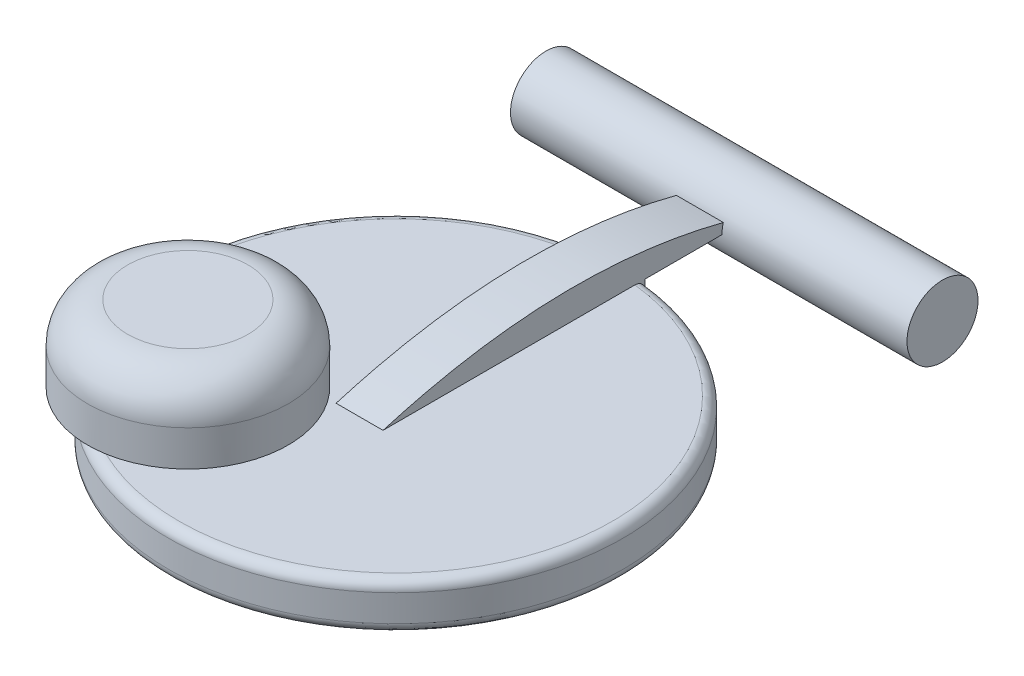
ISO-10303-21;
HEADER;
FILE_DESCRIPTION(('STEP AP214'),'2;1');
FILE_NAME('part.step','',(''),(''),'','','');
FILE_SCHEMA(('AUTOMOTIVE_DESIGN { 1 0 10303 214 1 1 1 1 }'));
ENDSEC;
DATA;
#1=APPLICATION_CONTEXT('core data for automotive mechanical design processes');
#2=APPLICATION_PROTOCOL_DEFINITION('international standard','automotive_design',2000,#1);
#3=PRODUCT_CONTEXT('',#1,'mechanical');
#4=PRODUCT('Part','Part','',(#3));
#5=PRODUCT_RELATED_PRODUCT_CATEGORY('part','',(#4));
#6=PRODUCT_DEFINITION_FORMATION('','',#4);
#7=PRODUCT_DEFINITION_CONTEXT('part definition',#1,'design');
#8=PRODUCT_DEFINITION('design','',#6,#7);
#9=PRODUCT_DEFINITION_SHAPE('','',#8);
#10=(LENGTH_UNIT() NAMED_UNIT(*) SI_UNIT(.MILLI.,.METRE.));
#11=(NAMED_UNIT(*) PLANE_ANGLE_UNIT() SI_UNIT($,.RADIAN.));
#12=(NAMED_UNIT(*) SI_UNIT($,.STERADIAN.) SOLID_ANGLE_UNIT());
#13=UNCERTAINTY_MEASURE_WITH_UNIT(LENGTH_MEASURE(1.E-05),#10,'distance_accuracy_value','');
#14=(GEOMETRIC_REPRESENTATION_CONTEXT(3) GLOBAL_UNCERTAINTY_ASSIGNED_CONTEXT((#13)) GLOBAL_UNIT_ASSIGNED_CONTEXT((#10,
#11,#12)) REPRESENTATION_CONTEXT('',''));
#15=CARTESIAN_POINT('',(0.,0.,0.));
#16=DIRECTION('',(0.,0.,1.));
#17=DIRECTION('',(1.,0.,0.));
#18=AXIS2_PLACEMENT_3D('',#15,#16,#17);
#19=CARTESIAN_POINT('',(25.0952,0.,0.));
#20=DIRECTION('',(-1.,0.,0.));
#21=DIRECTION('',(0.,0.,1.));
#22=AXIS2_PLACEMENT_3D('',#19,#20,#21);
#23=CYLINDRICAL_SURFACE('',#22,2.2479);
#24=CARTESIAN_POINT('',(0.,0.,0.));
#25=DIRECTION('',(1.,0.,0.));
#26=DIRECTION('',(0.,0.,-1.));
#27=AXIS2_PLACEMENT_3D('',#24,#25,#26);
#28=CIRCLE('',#27,2.2479);
#29=CARTESIAN_POINT('',(0.,0.,-2.2479));
#30=VERTEX_POINT('',#29);
#31=EDGE_CURVE('E253',#30,#30,#28,.T.);
#32=ORIENTED_EDGE('',*,*,#31,.T.);
#33=EDGE_LOOP('',(#32));
#34=FACE_BOUND('',#33,.T.);
#35=CARTESIAN_POINT('',(25.0952,0.,0.));
#36=DIRECTION('',(1.,0.,0.));
#37=DIRECTION('',(0.,0.,-1.));
#38=AXIS2_PLACEMENT_3D('',#35,#36,#37);
#39=CIRCLE('',#38,2.2479);
#40=CARTESIAN_POINT('',(25.0952,0.,-2.2479));
#41=VERTEX_POINT('',#40);
#42=EDGE_CURVE('E209',#41,#41,#39,.T.);
#43=ORIENTED_EDGE('',*,*,#42,.F.);
#44=EDGE_LOOP('',(#43));
#45=FACE_BOUND('',#44,.T.);
#46=CARTESIAN_POINT('',(13.3858,0.,0.));
#47=DIRECTION('',(-1.,0.,0.));
#48=DIRECTION('',(0.,0.,1.));
#49=AXIS2_PLACEMENT_3D('',#46,#47,#48);
#50=CIRCLE('',#49,2.2479);
#51=CARTESIAN_POINT('',(13.3858,0.,2.2479));
#52=VERTEX_POINT('',#51);
#53=CARTESIAN_POINT('',(13.3858,0.624937720984176,2.1592839680994));
#54=VERTEX_POINT('',#53);
#55=EDGE_CURVE('E213',#52,#54,#50,.T.);
#56=ORIENTED_EDGE('',*,*,#55,.F.);
#57=DIRECTION('',(-1.,0.,0.));
#58=VECTOR('',#57,1.);
#59=CARTESIAN_POINT('',(25.0952,0.,2.2479));
#60=LINE('',#59,#58);
#61=CARTESIAN_POINT('',(10.414,0.,2.2479));
#62=VERTEX_POINT('',#61);
#63=EDGE_CURVE('E208',#62,#52,#60,.F.);
#64=ORIENTED_EDGE('',*,*,#63,.F.);
#65=CARTESIAN_POINT('',(10.414,0.,0.));
#66=DIRECTION('',(-1.,0.,0.));
#67=DIRECTION('',(0.,0.,1.));
#68=AXIS2_PLACEMENT_3D('',#65,#66,#67);
#69=CIRCLE('',#68,2.2479);
#70=CARTESIAN_POINT('',(10.414,0.624937720984176,2.1592839680994));
#71=VERTEX_POINT('',#70);
#72=EDGE_CURVE('E198',#62,#71,#69,.T.);
#73=ORIENTED_EDGE('',*,*,#72,.T.);
#74=DIRECTION('',(-1.,0.,0.));
#75=VECTOR('',#74,1.);
#76=CARTESIAN_POINT('',(13.3858,0.624937720984176,2.1592839680994));
#77=LINE('',#76,#75);
#78=EDGE_CURVE('E217',#54,#71,#77,.T.);
#79=ORIENTED_EDGE('',*,*,#78,.F.);
#80=EDGE_LOOP('',(#56,#64,#73,#79));
#81=FACE_BOUND('',#80,.T.);
#82=ADVANCED_FACE('F39',(#34,#45,#81),#23,.T.);
#83=CARTESIAN_POINT('',(25.0952,0.,0.));
#84=DIRECTION('',(1.,0.,0.));
#85=DIRECTION('',(0.,0.,-1.));
#86=AXIS2_PLACEMENT_3D('',#83,#84,#85);
#87=PLANE('',#86);
#88=ORIENTED_EDGE('',*,*,#42,.T.);
#89=EDGE_LOOP('',(#88));
#90=FACE_BOUND('',#89,.T.);
#91=ADVANCED_FACE('F152',(#90),#87,.T.);
#92=CARTESIAN_POINT('',(0.,0.,0.));
#93=DIRECTION('',(1.,0.,0.));
#94=DIRECTION('',(0.,0.,-1.));
#95=AXIS2_PLACEMENT_3D('',#92,#93,#94);
#96=PLANE('',#95);
#97=ORIENTED_EDGE('',*,*,#31,.F.);
#98=EDGE_LOOP('',(#97));
#99=FACE_BOUND('',#98,.T.);
#100=ADVANCED_FACE('F149',(#99),#96,.F.);
#101=CARTESIAN_POINT('',(13.3858,0.,0.));
#102=CARTESIAN_POINT('',(13.3858,3.66065338683689,11.4154433747726));
#103=CARTESIAN_POINT('',(13.3858,0.,23.6982));
#104=B_SPLINE_CURVE_WITH_KNOTS('',2,(#101,#102,#103),.UNSPECIFIED.,.F.,.F.,(3,3),(0.,1.),.UNSPECIFIED.);
#105=DIRECTION('',(-1.,0.,0.));
#106=VECTOR('',#105,1.);
#107=SURFACE_OF_LINEAR_EXTRUSION('',#104,#106);
#108=CARTESIAN_POINT('',(13.3858,0.,23.6982));
#109=VERTEX_POINT('',#108);
#110=EDGE_CURVE('E130',#54,#109,#104,.T.);
#111=ORIENTED_EDGE('',*,*,#110,.F.);
#112=ORIENTED_EDGE('',*,*,#78,.T.);
#113=CARTESIAN_POINT('',(10.414,0.,0.));
#114=CARTESIAN_POINT('',(10.414,3.66065338683689,11.4154433747726));
#115=CARTESIAN_POINT('',(10.414,0.,23.6982));
#116=B_SPLINE_CURVE_WITH_KNOTS('',2,(#113,#114,#115),.UNSPECIFIED.,.F.,.F.,(3,3),(0.,1.),.UNSPECIFIED.);
#117=CARTESIAN_POINT('',(10.414,0.,23.6982));
#118=VERTEX_POINT('',#117);
#119=EDGE_CURVE('E129',#71,#118,#116,.T.);
#120=ORIENTED_EDGE('',*,*,#119,.T.);
#121=DIRECTION('',(-1.,0.,0.));
#122=VECTOR('',#121,1.);
#123=CARTESIAN_POINT('',(13.3858,0.,23.6982));
#124=LINE('',#123,#122);
#125=EDGE_CURVE('E244',#109,#118,#124,.T.);
#126=ORIENTED_EDGE('',*,*,#125,.F.);
#127=EDGE_LOOP('',(#111,#112,#120,#126));
#128=FACE_BOUND('',#127,.T.);
#129=ADVANCED_FACE('F144',(#128),#107,.F.);
#130=CARTESIAN_POINT('',(13.3858,0.,0.));
#131=DIRECTION('',(0.,1.,0.));
#132=DIRECTION('',(0.,0.,1.));
#133=AXIS2_PLACEMENT_3D('',#130,#131,#132);
#134=PLANE('',#133);
#135=CARTESIAN_POINT('',(11.8999,0.,21.4057297610828));
#136=DIRECTION('',(0.,-1.,0.));
#137=DIRECTION('',(0.,0.,-1.));
#138=AXIS2_PLACEMENT_3D('',#135,#136,#137);
#139=CIRCLE('',#138,14.3637);
#140=CARTESIAN_POINT('',(10.414,0.,7.11909338718434));
#141=VERTEX_POINT('',#140);
#142=CARTESIAN_POINT('',(13.3858,0.,7.11909338718434));
#143=VERTEX_POINT('',#142);
#144=EDGE_CURVE('E118',#141,#143,#139,.T.);
#145=ORIENTED_EDGE('',*,*,#144,.F.);
#146=DIRECTION('',(0.,0.,-1.));
#147=VECTOR('',#146,1.);
#148=CARTESIAN_POINT('',(10.414,0.,0.));
#149=LINE('',#148,#147);
#150=EDGE_CURVE('E201',#141,#62,#149,.T.);
#151=ORIENTED_EDGE('',*,*,#150,.T.);
#152=ORIENTED_EDGE('',*,*,#63,.T.);
#153=DIRECTION('',(0.,0.,-1.));
#154=VECTOR('',#153,1.);
#155=CARTESIAN_POINT('',(13.3858,0.,0.));
#156=LINE('',#155,#154);
#157=EDGE_CURVE('E136',#143,#52,#156,.T.);
#158=ORIENTED_EDGE('',*,*,#157,.F.);
#159=EDGE_LOOP('',(#145,#151,#152,#158));
#160=FACE_BOUND('',#159,.T.);
#161=ADVANCED_FACE('F148',(#160),#134,.F.);
#162=CARTESIAN_POINT('',(13.3858,1.83032669341844,11.6322716873863));
#163=DIRECTION('',(-1.,0.,0.));
#164=DIRECTION('',(0.,0.,1.));
#165=AXIS2_PLACEMENT_3D('',#162,#163,#164);
#166=PLANE('',#165);
#167=CARTESIAN_POINT('',(13.3858,0.,7.75767843937395));
#168=VERTEX_POINT('',#167);
#169=EDGE_CURVE('E138',#109,#168,#156,.T.);
#170=ORIENTED_EDGE('',*,*,#169,.T.);
#171=CARTESIAN_POINT('',(13.3858,0.,7.75767843937395));
#172=CARTESIAN_POINT('',(13.3858,2.97068111461027E-05,7.72160117518703));
#173=CARTESIAN_POINT('',(13.3858,-0.00303682064163267,7.68553150399673));
#174=CARTESIAN_POINT('',(13.3858,-0.0151466425570312,7.61443119839856));
#175=CARTESIAN_POINT('',(13.3858,-0.0241863126812481,7.57939994736554));
#176=CARTESIAN_POINT('',(13.3858,-0.0480337394976081,7.51133549365649));
#177=CARTESIAN_POINT('',(13.3858,-0.0628446585327272,7.47830339789734));
#178=CARTESIAN_POINT('',(13.3858,-0.0978123026150151,7.41521097893355));
#179=CARTESIAN_POINT('',(13.3858,-0.117967805928113,7.38514997871063));
#180=CARTESIAN_POINT('',(13.3858,-0.163000829874994,7.32894173259384));
#181=CARTESIAN_POINT('',(13.3858,-0.187864772187398,7.30278361005332));
#182=CARTESIAN_POINT('',(13.3858,-0.241658567642368,7.25503488159229));
#183=CARTESIAN_POINT('',(13.3858,-0.270589175021046,7.23344512482247));
#184=CARTESIAN_POINT('',(13.3858,-0.33152627761765,7.19557314427944));
#185=CARTESIAN_POINT('',(13.3858,-0.363516107796267,7.17926407357612));
#186=CARTESIAN_POINT('',(13.3858,-0.429781699348276,7.15228675449933));
#187=CARTESIAN_POINT('',(13.3858,-0.464055926974395,7.14161476350328));
#188=CARTESIAN_POINT('',(13.3858,-0.521298764311682,7.12898958243914));
#189=CARTESIAN_POINT('',(13.3858,-0.543895398009902,7.12528070953769));
#190=CARTESIAN_POINT('',(13.3858,-0.589324733486296,7.12033304911269));
#191=CARTESIAN_POINT('',(13.3858,-0.612157051893343,7.11909074033862));
#192=CARTESIAN_POINT('',(13.3858,-0.635,7.11909338718434));
#193=B_SPLINE_CURVE_WITH_KNOTS('',3,(#171,#172,#173,#174,#175,#176,#177,#178,#179,#180,#181,
#182,#183,#184,#185,#186,#187,#188,#189,#190,#191,#192),.UNSPECIFIED.,.F.,.F.,(4,2,2,2,2,2,2,2,
2,2,4),(0.,0.108091061507948,0.216116596490901,0.32420140725107,0.432261531857593,
0.540014648949092,0.647787777225935,0.755004056416397,0.86214906181509,0.930721396033382,
0.999195766253674),.UNSPECIFIED.);
#194=CARTESIAN_POINT('',(13.3858,-0.635,7.11909338718434));
#195=VERTEX_POINT('',#194);
#196=EDGE_CURVE('E102',#168,#195,#193,.T.);
#197=ORIENTED_EDGE('',*,*,#196,.T.);
#198=DIRECTION('',(0.,1.,0.));
#199=VECTOR('',#198,1.);
#200=CARTESIAN_POINT('',(13.3858,0.,7.11909338718434));
#201=LINE('',#200,#199);
#202=EDGE_CURVE('E63',#143,#195,#201,.F.);
#203=ORIENTED_EDGE('',*,*,#202,.F.);
#204=ORIENTED_EDGE('',*,*,#157,.T.);
#205=ORIENTED_EDGE('',*,*,#55,.T.);
#206=ORIENTED_EDGE('',*,*,#110,.T.);
#207=EDGE_LOOP('',(#170,#197,#203,#204,#205,#206));
#208=FACE_BOUND('',#207,.T.);
#209=ADVANCED_FACE('F182',(#208),#166,.F.);
#210=CARTESIAN_POINT('',(10.414,1.83032669341844,11.6322716873863));
#211=DIRECTION('',(-1.,0.,0.));
#212=DIRECTION('',(0.,0.,1.));
#213=AXIS2_PLACEMENT_3D('',#210,#211,#212);
#214=PLANE('',#213);
#215=ORIENTED_EDGE('',*,*,#72,.F.);
#216=ORIENTED_EDGE('',*,*,#150,.F.);
#217=DIRECTION('',(0.,1.,0.));
#218=VECTOR('',#217,1.);
#219=CARTESIAN_POINT('',(10.414,-0.635,7.11909338718434));
#220=LINE('',#219,#218);
#221=CARTESIAN_POINT('',(10.414,-0.635,7.11909338718434));
#222=VERTEX_POINT('',#221);
#223=EDGE_CURVE('E235',#222,#141,#220,.T.);
#224=ORIENTED_EDGE('',*,*,#223,.F.);
#225=CARTESIAN_POINT('',(10.414,-0.635,7.11909338718434));
#226=CARTESIAN_POINT('',(10.414,-0.59941665060096,7.11906227621359));
#227=CARTESIAN_POINT('',(10.414,-0.563843459084194,7.12209858933455));
#228=CARTESIAN_POINT('',(10.414,-0.493737871331731,7.13407519672551));
#229=CARTESIAN_POINT('',(10.414,-0.45920453449133,7.14300997685231));
#230=CARTESIAN_POINT('',(10.414,-0.392114595997997,7.16655849997247));
#231=CARTESIAN_POINT('',(10.414,-0.359558850596535,7.18117468290072));
#232=CARTESIAN_POINT('',(10.414,-0.297359781720227,7.2156488574687));
#233=CARTESIAN_POINT('',(10.414,-0.267716066469407,7.23550614265701));
#234=CARTESIAN_POINT('',(10.414,-0.212099585063527,7.27994490823891));
#235=CARTESIAN_POINT('',(10.414,-0.186135392780347,7.30453711744254));
#236=CARTESIAN_POINT('',(10.414,-0.138673770741469,7.35771696560872));
#237=CARTESIAN_POINT('',(10.414,-0.117177251250485,7.38630541680379));
#238=CARTESIAN_POINT('',(10.414,-0.0791462945986569,7.4468199595304));
#239=CARTESIAN_POINT('',(10.414,-0.0626387155338492,7.4787629113213));
#240=CARTESIAN_POINT('',(10.414,-0.0351967422836382,7.54495153606811));
#241=CARTESIAN_POINT('',(10.414,-0.0242595528976203,7.57919604432682));
#242=CARTESIAN_POINT('',(10.414,-0.01085189480763,7.63763752393045));
#243=CARTESIAN_POINT('',(10.414,-0.00678474874526031,7.66148076187855));
#244=CARTESIAN_POINT('',(10.414,-0.00135906570800855,7.70943899778735));
#245=CARTESIAN_POINT('',(10.414,3.3198450494382E-06,7.73355356044249));
#246=CARTESIAN_POINT('',(10.414,0.,7.75767843937395));
#247=B_SPLINE_CURVE_WITH_KNOTS('',3,(#225,#226,#227,#228,#229,#230,#231,#232,#233,#234,#235,
#236,#237,#238,#239,#240,#241,#242,#243,#244,#245,#246),.UNSPECIFIED.,.F.,.F.,(4,2,2,2,2,2,2,2,
2,2,4),(0.,0.10660597348858,0.213112427939985,0.319664673272789,0.426202563690399,
0.532984760139044,0.639788691613397,0.747157762414153,0.854472902604054,0.92689211717815,
0.999208213071355),.UNSPECIFIED.);
#248=CARTESIAN_POINT('',(10.414,0.,7.75767843937395));
#249=VERTEX_POINT('',#248);
#250=EDGE_CURVE('E170',#222,#249,#247,.T.);
#251=ORIENTED_EDGE('',*,*,#250,.T.);
#252=EDGE_CURVE('E137',#118,#249,#149,.T.);
#253=ORIENTED_EDGE('',*,*,#252,.F.);
#254=ORIENTED_EDGE('',*,*,#119,.F.);
#255=EDGE_LOOP('',(#215,#216,#224,#251,#253,#254));
#256=FACE_BOUND('',#255,.T.);
#257=ADVANCED_FACE('F186',(#256),#214,.T.);
#258=CARTESIAN_POINT('',(11.8999,0.,21.4057297610828));
#259=DIRECTION('',(0.,-1.,0.));
#260=DIRECTION('',(0.,0.,-1.));
#261=AXIS2_PLACEMENT_3D('',#258,#259,#260);
#262=PLANE('',#261);
#263=CARTESIAN_POINT('',(4.84420956713798,0.,27.5082));
#264=DIRECTION('',(0.,1.,0.));
#265=DIRECTION('',(0.,0.,1.));
#266=AXIS2_PLACEMENT_3D('',#263,#264,#265);
#267=CIRCLE('',#266,6.35);
#268=CARTESIAN_POINT('',(5.92421754449995,0.,33.7656821429098));
#269=VERTEX_POINT('',#268);
#270=CARTESIAN_POINT('',(-1.19227488131793,0.,25.5375768742984));
#271=VERTEX_POINT('',#270);
#272=EDGE_CURVE('E111',#269,#271,#267,.T.);
#273=ORIENTED_EDGE('',*,*,#272,.F.);
#274=CARTESIAN_POINT('',(11.8999,0.,21.4057297610828));
#275=DIRECTION('',(0.,-1.,0.));
#276=DIRECTION('',(0.,0.,-1.));
#277=AXIS2_PLACEMENT_3D('',#274,#275,#276);
#278=CIRCLE('',#277,13.7287);
#279=EDGE_CURVE('E98',#269,#168,#278,.F.);
#280=ORIENTED_EDGE('',*,*,#279,.T.);
#281=ORIENTED_EDGE('',*,*,#169,.F.);
#282=ORIENTED_EDGE('',*,*,#125,.T.);
#283=ORIENTED_EDGE('',*,*,#252,.T.);
#284=EDGE_CURVE('E109',#249,#271,#278,.F.);
#285=ORIENTED_EDGE('',*,*,#284,.T.);
#286=EDGE_LOOP('',(#273,#280,#281,#282,#283,#285));
#287=FACE_BOUND('',#286,.T.);
#288=ADVANCED_FACE('F112',(#287),#262,.F.);
#289=CARTESIAN_POINT('',(11.8999,-2.9718,21.4057297610828));
#290=DIRECTION('',(0.,1.,0.));
#291=DIRECTION('',(0.,0.,1.));
#292=AXIS2_PLACEMENT_3D('',#289,#290,#291);
#293=CYLINDRICAL_SURFACE('',#292,14.3637);
#294=CARTESIAN_POINT('',(11.8999,-2.3368,21.4057297610828));
#295=DIRECTION('',(0.,-1.,0.));
#296=DIRECTION('',(0.,0.,-1.));
#297=AXIS2_PLACEMENT_3D('',#294,#295,#296);
#298=CIRCLE('',#297,14.3637);
#299=CARTESIAN_POINT('',(11.8999,-2.3368,7.04202976108285));
#300=VERTEX_POINT('',#299);
#301=EDGE_CURVE('E107',#300,#300,#298,.F.);
#302=ORIENTED_EDGE('',*,*,#301,.T.);
#303=EDGE_LOOP('',(#302));
#304=FACE_BOUND('',#303,.T.);
#305=CARTESIAN_POINT('',(11.8999,-0.635,21.4057297610828));
#306=DIRECTION('',(0.,-1.,0.));
#307=DIRECTION('',(0.,0.,-1.));
#308=AXIS2_PLACEMENT_3D('',#305,#306,#307);
#309=CIRCLE('',#308,14.3637);
#310=EDGE_CURVE('E231',#195,#222,#309,.T.);
#311=ORIENTED_EDGE('',*,*,#310,.T.);
#312=ORIENTED_EDGE('',*,*,#223,.T.);
#313=ORIENTED_EDGE('',*,*,#144,.T.);
#314=ORIENTED_EDGE('',*,*,#202,.T.);
#315=EDGE_LOOP('',(#311,#312,#313,#314));
#316=FACE_BOUND('',#315,.T.);
#317=ADVANCED_FACE('F187',(#304,#316),#293,.T.);
#318=CARTESIAN_POINT('',(11.8999,-2.9718,21.4057297610828));
#319=DIRECTION('',(0.,-1.,0.));
#320=DIRECTION('',(0.,0.,-1.));
#321=AXIS2_PLACEMENT_3D('',#318,#319,#320);
#322=PLANE('',#321);
#323=CARTESIAN_POINT('',(11.8999,-2.9718,21.4057297610828));
#324=DIRECTION('',(0.,-1.,0.));
#325=DIRECTION('',(0.,0.,-1.));
#326=AXIS2_PLACEMENT_3D('',#323,#324,#325);
#327=CIRCLE('',#326,13.7287);
#328=CARTESIAN_POINT('',(11.8999,-2.9718,7.67702976108285));
#329=VERTEX_POINT('',#328);
#330=EDGE_CURVE('E225',#329,#329,#327,.T.);
#331=ORIENTED_EDGE('',*,*,#330,.T.);
#332=EDGE_LOOP('',(#331));
#333=FACE_BOUND('',#332,.T.);
#334=ADVANCED_FACE('F164',(#333),#322,.T.);
#335=CARTESIAN_POINT('',(11.8999,-2.3368,21.4057297610828));
#336=DIRECTION('',(0.,-1.,0.));
#337=DIRECTION('',(0.,0.,-1.));
#338=AXIS2_PLACEMENT_3D('',#335,#336,#337);
#339=TOROIDAL_SURFACE('',#338,13.7287,0.635);
#340=ORIENTED_EDGE('',*,*,#301,.F.);
#341=EDGE_LOOP('',(#340));
#342=FACE_BOUND('',#341,.T.);
#343=ORIENTED_EDGE('',*,*,#330,.F.);
#344=EDGE_LOOP('',(#343));
#345=FACE_BOUND('',#344,.T.);
#346=ADVANCED_FACE('F162',(#342,#345),#339,.T.);
#347=CARTESIAN_POINT('',(11.8999,-0.635,21.4057297610828));
#348=DIRECTION('',(0.,-1.,0.));
#349=DIRECTION('',(0.,0.,-1.));
#350=AXIS2_PLACEMENT_3D('',#347,#348,#349);
#351=TOROIDAL_SURFACE('',#350,13.7287,0.635);
#352=ORIENTED_EDGE('',*,*,#196,.F.);
#353=ORIENTED_EDGE('',*,*,#279,.F.);
#354=EDGE_CURVE('E55',#271,#269,#278,.F.);
#355=ORIENTED_EDGE('',*,*,#354,.F.);
#356=ORIENTED_EDGE('',*,*,#284,.F.);
#357=ORIENTED_EDGE('',*,*,#250,.F.);
#358=ORIENTED_EDGE('',*,*,#310,.F.);
#359=EDGE_LOOP('',(#352,#353,#355,#356,#357,#358));
#360=FACE_BOUND('',#359,.T.);
#361=ADVANCED_FACE('F100',(#360),#351,.T.);
#362=CARTESIAN_POINT('',(4.84420956713798,4.8006,27.5082));
#363=DIRECTION('',(0.,-1.,0.));
#364=DIRECTION('',(0.,0.,-1.));
#365=AXIS2_PLACEMENT_3D('',#362,#363,#364);
#366=CYLINDRICAL_SURFACE('',#365,6.35);
#367=CARTESIAN_POINT('',(4.84420956713798,2.2606,27.5082));
#368=DIRECTION('',(0.,1.,0.));
#369=DIRECTION('',(0.,0.,1.));
#370=AXIS2_PLACEMENT_3D('',#367,#368,#369);
#371=CIRCLE('',#370,6.35);
#372=CARTESIAN_POINT('',(4.84420956713798,2.2606,33.8582));
#373=VERTEX_POINT('',#372);
#374=EDGE_CURVE('E11',#373,#373,#371,.F.);
#375=ORIENTED_EDGE('',*,*,#374,.T.);
#376=EDGE_LOOP('',(#375));
#377=FACE_BOUND('',#376,.T.);
#378=ORIENTED_EDGE('',*,*,#272,.T.);
#379=EDGE_CURVE('E119',#271,#269,#267,.T.);
#380=ORIENTED_EDGE('',*,*,#379,.T.);
#381=EDGE_LOOP('',(#378,#380));
#382=FACE_BOUND('',#381,.T.);
#383=ADVANCED_FACE('F124',(#377,#382),#366,.T.);
#384=CARTESIAN_POINT('',(4.84420956713798,4.8006,27.5082));
#385=DIRECTION('',(0.,1.,0.));
#386=DIRECTION('',(0.,0.,1.));
#387=AXIS2_PLACEMENT_3D('',#384,#385,#386);
#388=PLANE('',#387);
#389=CARTESIAN_POINT('',(4.84420956713798,4.8006,27.5082));
#390=DIRECTION('',(0.,1.,0.));
#391=DIRECTION('',(0.,0.,1.));
#392=AXIS2_PLACEMENT_3D('',#389,#390,#391);
#393=CIRCLE('',#392,3.81);
#394=CARTESIAN_POINT('',(4.84420956713798,4.8006,31.3182));
#395=VERTEX_POINT('',#394);
#396=EDGE_CURVE('E48',#395,#395,#393,.T.);
#397=ORIENTED_EDGE('',*,*,#396,.T.);
#398=EDGE_LOOP('',(#397));
#399=FACE_BOUND('',#398,.T.);
#400=ADVANCED_FACE('F280',(#399),#388,.T.);
#401=CARTESIAN_POINT('',(4.84420956713798,0.,27.5082));
#402=DIRECTION('',(0.,1.,0.));
#403=DIRECTION('',(0.,0.,1.));
#404=AXIS2_PLACEMENT_3D('',#401,#402,#403);
#405=PLANE('',#404);
#406=ORIENTED_EDGE('',*,*,#379,.F.);
#407=ORIENTED_EDGE('',*,*,#354,.T.);
#408=EDGE_LOOP('',(#406,#407));
#409=FACE_BOUND('',#408,.T.);
#410=ADVANCED_FACE('F122',(#409),#405,.F.);
#411=CARTESIAN_POINT('',(4.84420956713798,2.2606,27.5082));
#412=DIRECTION('',(0.,1.,0.));
#413=DIRECTION('',(0.,0.,1.));
#414=AXIS2_PLACEMENT_3D('',#411,#412,#413);
#415=TOROIDAL_SURFACE('',#414,3.81,2.54);
#416=ORIENTED_EDGE('',*,*,#374,.F.);
#417=EDGE_LOOP('',(#416));
#418=FACE_BOUND('',#417,.T.);
#419=ORIENTED_EDGE('',*,*,#396,.F.);
#420=EDGE_LOOP('',(#419));
#421=FACE_BOUND('',#420,.T.);
#422=ADVANCED_FACE('F41',(#418,#421),#415,.T.);
#423=CLOSED_SHELL('',(#82,#91,#100,#129,#161,#209,#257,#288,#317,#334,#346,#361,#383,#400,#410,#422));
#424=MANIFOLD_SOLID_BREP('B2',#423);
#425=ADVANCED_BREP_SHAPE_REPRESENTATION('',(#18,#424),#14);
#426=SHAPE_DEFINITION_REPRESENTATION(#9,#425);
ENDSEC;
END-ISO-10303-21;
